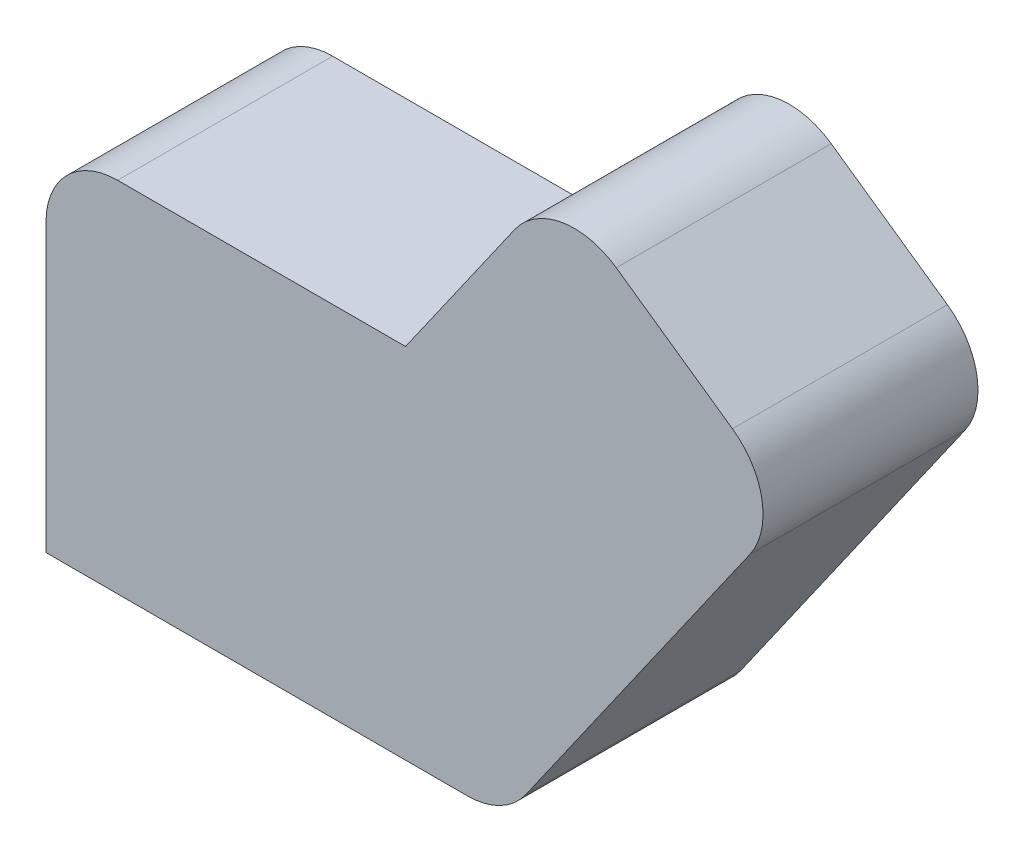
ISO-10303-21;
HEADER;
FILE_DESCRIPTION(('STEP AP214'),'2;1');
FILE_NAME('part.step','',(''),(''),'','','');
FILE_SCHEMA(('AUTOMOTIVE_DESIGN { 1 0 10303 214 1 1 1 1 }'));
ENDSEC;
DATA;
#1=APPLICATION_CONTEXT('core data for automotive mechanical design processes');
#2=APPLICATION_PROTOCOL_DEFINITION('international standard','automotive_design',2000,#1);
#3=PRODUCT_CONTEXT('',#1,'mechanical');
#4=PRODUCT('Part','Part','',(#3));
#5=PRODUCT_RELATED_PRODUCT_CATEGORY('part','',(#4));
#6=PRODUCT_DEFINITION_FORMATION('','',#4);
#7=PRODUCT_DEFINITION_CONTEXT('part definition',#1,'design');
#8=PRODUCT_DEFINITION('design','',#6,#7);
#9=PRODUCT_DEFINITION_SHAPE('','',#8);
#10=(LENGTH_UNIT() NAMED_UNIT(*) SI_UNIT(.MILLI.,.METRE.));
#11=(NAMED_UNIT(*) PLANE_ANGLE_UNIT() SI_UNIT($,.RADIAN.));
#12=(NAMED_UNIT(*) SI_UNIT($,.STERADIAN.) SOLID_ANGLE_UNIT());
#13=UNCERTAINTY_MEASURE_WITH_UNIT(LENGTH_MEASURE(1.E-05),#10,'distance_accuracy_value','');
#14=(GEOMETRIC_REPRESENTATION_CONTEXT(3) GLOBAL_UNCERTAINTY_ASSIGNED_CONTEXT((#13)) GLOBAL_UNIT_ASSIGNED_CONTEXT((#10,
#11,#12)) REPRESENTATION_CONTEXT('',''));
#15=CARTESIAN_POINT('',(0.,0.,0.));
#16=DIRECTION('',(0.,0.,1.));
#17=DIRECTION('',(1.,0.,0.));
#18=AXIS2_PLACEMENT_3D('',#15,#16,#17);
#19=CARTESIAN_POINT('',(0.,25.,15.));
#20=DIRECTION('',(1.,0.,0.));
#21=DIRECTION('',(0.,0.,-1.));
#22=AXIS2_PLACEMENT_3D('',#19,#20,#21);
#23=PLANE('',#22);
#24=DIRECTION('',(0.,-1.,0.));
#25=VECTOR('',#24,1.);
#26=CARTESIAN_POINT('',(0.,25.,15.));
#27=LINE('',#26,#25);
#28=CARTESIAN_POINT('',(0.,20.,15.));
#29=VERTEX_POINT('',#28);
#30=CARTESIAN_POINT('',(0.,0.,15.));
#31=VERTEX_POINT('',#30);
#32=EDGE_CURVE('E110',#29,#31,#27,.T.);
#33=ORIENTED_EDGE('',*,*,#32,.F.);
#34=DIRECTION('',(0.,0.,-1.));
#35=VECTOR('',#34,1.);
#36=CARTESIAN_POINT('',(0.,20.,15.));
#37=LINE('',#36,#35);
#38=CARTESIAN_POINT('',(0.,20.,0.));
#39=VERTEX_POINT('',#38);
#40=EDGE_CURVE('E162',#29,#39,#37,.T.);
#41=ORIENTED_EDGE('',*,*,#40,.T.);
#42=DIRECTION('',(0.,-1.,0.));
#43=VECTOR('',#42,1.);
#44=CARTESIAN_POINT('',(0.,25.,0.));
#45=LINE('',#44,#43);
#46=CARTESIAN_POINT('',(0.,0.,0.));
#47=VERTEX_POINT('',#46);
#48=EDGE_CURVE('E134',#39,#47,#45,.T.);
#49=ORIENTED_EDGE('',*,*,#48,.T.);
#50=DIRECTION('',(0.,0.,-1.));
#51=VECTOR('',#50,1.);
#52=CARTESIAN_POINT('',(0.,0.,15.));
#53=LINE('',#52,#51);
#54=EDGE_CURVE('E128',#31,#47,#53,.T.);
#55=ORIENTED_EDGE('',*,*,#54,.F.);
#56=EDGE_LOOP('',(#33,#41,#49,#55));
#57=FACE_BOUND('',#56,.T.);
#58=ADVANCED_FACE('F33',(#57),#23,.F.);
#59=CARTESIAN_POINT('',(0.,0.,15.));
#60=DIRECTION('',(0.,1.,0.));
#61=DIRECTION('',(0.,0.,1.));
#62=AXIS2_PLACEMENT_3D('',#59,#60,#61);
#63=PLANE('',#62);
#64=DIRECTION('',(1.,0.,0.));
#65=VECTOR('',#64,1.);
#66=CARTESIAN_POINT('',(0.,0.,0.));
#67=LINE('',#66,#65);
#68=CARTESIAN_POINT('',(29.3971647472413,0.,0.));
#69=VERTEX_POINT('',#68);
#70=EDGE_CURVE('E187',#47,#69,#67,.T.);
#71=ORIENTED_EDGE('',*,*,#70,.T.);
#72=DIRECTION('',(0.,0.,-1.));
#73=VECTOR('',#72,1.);
#74=CARTESIAN_POINT('',(29.3971647472413,0.,15.));
#75=LINE('',#74,#73);
#76=CARTESIAN_POINT('',(29.3971647472413,0.,15.));
#77=VERTEX_POINT('',#76);
#78=EDGE_CURVE('E130',#69,#77,#75,.F.);
#79=ORIENTED_EDGE('',*,*,#78,.T.);
#80=DIRECTION('',(1.,0.,0.));
#81=VECTOR('',#80,1.);
#82=CARTESIAN_POINT('',(0.,0.,15.));
#83=LINE('',#82,#81);
#84=EDGE_CURVE('E113',#31,#77,#83,.T.);
#85=ORIENTED_EDGE('',*,*,#84,.F.);
#86=ORIENTED_EDGE('',*,*,#54,.T.);
#87=EDGE_LOOP('',(#71,#79,#85,#86));
#88=FACE_BOUND('',#87,.T.);
#89=ADVANCED_FACE('F127',(#88),#63,.F.);
#90=CARTESIAN_POINT('',(32.,0.,15.));
#91=DIRECTION('',(-0.819152044288993,0.573576436351044,0.));
#92=DIRECTION('',(-0.573576436351044,-0.819152044288994,0.));
#93=AXIS2_PLACEMENT_3D('',#90,#91,#92);
#94=PLANE('',#93);
#95=DIRECTION('',(0.573576436351044,0.819152044288993,0.));
#96=VECTOR('',#95,1.);
#97=CARTESIAN_POINT('',(32.,0.,0.));
#98=LINE('',#97,#96);
#99=CARTESIAN_POINT('',(33.4929249686862,2.13211781824478,0.));
#100=VERTEX_POINT('',#99);
#101=CARTESIAN_POINT('',(49.1321178182448,24.4671999133975,0.));
#102=VERTEX_POINT('',#101);
#103=EDGE_CURVE('E184',#100,#102,#98,.T.);
#104=ORIENTED_EDGE('',*,*,#103,.T.);
#105=DIRECTION('',(0.,0.,-1.));
#106=VECTOR('',#105,1.);
#107=CARTESIAN_POINT('',(49.1321178182448,24.4671999133975,15.));
#108=LINE('',#107,#106);
#109=CARTESIAN_POINT('',(49.1321178182448,24.4671999133975,15.));
#110=VERTEX_POINT('',#109);
#111=EDGE_CURVE('E41',#102,#110,#108,.F.);
#112=ORIENTED_EDGE('',*,*,#111,.T.);
#113=DIRECTION('',(0.573576436351044,0.819152044288993,0.));
#114=VECTOR('',#113,1.);
#115=CARTESIAN_POINT('',(32.,0.,15.));
#116=LINE('',#115,#114);
#117=CARTESIAN_POINT('',(33.4929249686862,2.13211781824478,15.));
#118=VERTEX_POINT('',#117);
#119=EDGE_CURVE('E131',#118,#110,#116,.T.);
#120=ORIENTED_EDGE('',*,*,#119,.F.);
#121=DIRECTION('',(0.,0.,-1.));
#122=VECTOR('',#121,1.);
#123=CARTESIAN_POINT('',(33.4929249686862,2.13211781824478,15.));
#124=LINE('',#123,#122);
#125=EDGE_CURVE('E154',#118,#100,#124,.T.);
#126=ORIENTED_EDGE('',*,*,#125,.T.);
#127=EDGE_LOOP('',(#104,#112,#120,#126));
#128=FACE_BOUND('',#127,.T.);
#129=ADVANCED_FACE('F216',(#128),#94,.F.);
#130=CARTESIAN_POINT('',(52.,28.5629601348424,15.));
#131=DIRECTION('',(-0.573576436351043,-0.819152044288994,0.));
#132=DIRECTION('',(0.819152044288994,-0.573576436351043,0.));
#133=AXIS2_PLACEMENT_3D('',#130,#131,#132);
#134=PLANE('',#133);
#135=DIRECTION('',(-0.819152044288994,0.573576436351043,0.));
#136=VECTOR('',#135,1.);
#137=CARTESIAN_POINT('',(52.,28.5629601348424,15.));
#138=LINE('',#137,#136);
#139=CARTESIAN_POINT('',(47.904239778555,31.4308423165977,15.));
#140=VERTEX_POINT('',#139);
#141=CARTESIAN_POINT('',(39.794634540094,37.109249036473,15.));
#142=VERTEX_POINT('',#141);
#143=EDGE_CURVE('E177',#140,#142,#138,.T.);
#144=ORIENTED_EDGE('',*,*,#143,.F.);
#145=DIRECTION('',(0.,0.,-1.));
#146=VECTOR('',#145,1.);
#147=CARTESIAN_POINT('',(47.904239778555,31.4308423165977,15.));
#148=LINE('',#147,#146);
#149=CARTESIAN_POINT('',(47.904239778555,31.4308423165977,0.));
#150=VERTEX_POINT('',#149);
#151=EDGE_CURVE('E169',#140,#150,#148,.T.);
#152=ORIENTED_EDGE('',*,*,#151,.T.);
#153=DIRECTION('',(-0.819152044288994,0.573576436351043,0.));
#154=VECTOR('',#153,1.);
#155=CARTESIAN_POINT('',(52.,28.5629601348424,0.));
#156=LINE('',#155,#154);
#157=CARTESIAN_POINT('',(39.794634540094,37.109249036473,0.));
#158=VERTEX_POINT('',#157);
#159=EDGE_CURVE('E176',#150,#158,#156,.T.);
#160=ORIENTED_EDGE('',*,*,#159,.T.);
#161=DIRECTION('',(0.,0.,-1.));
#162=VECTOR('',#161,1.);
#163=CARTESIAN_POINT('',(39.794634540094,37.109249036473,15.));
#164=LINE('',#163,#162);
#165=EDGE_CURVE('E149',#158,#142,#164,.F.);
#166=ORIENTED_EDGE('',*,*,#165,.T.);
#167=EDGE_LOOP('',(#144,#152,#160,#166));
#168=FACE_BOUND('',#167,.T.);
#169=ADVANCED_FACE('F175',(#168),#134,.F.);
#170=CARTESIAN_POINT('',(35.6169591142201,40.0344888618633,15.));
#171=DIRECTION('',(0.819152044288993,-0.573576436351044,0.));
#172=DIRECTION('',(0.573576436351044,0.819152044288994,0.));
#173=AXIS2_PLACEMENT_3D('',#170,#171,#172);
#174=PLANE('',#173);
#175=DIRECTION('',(-0.573576436351044,-0.819152044288993,0.));
#176=VECTOR('',#175,1.);
#177=CARTESIAN_POINT('',(35.6169591142201,40.0344888618633,15.));
#178=LINE('',#177,#176);
#179=CARTESIAN_POINT('',(32.6917192888298,35.8568134359894,15.));
#180=VERTEX_POINT('',#179);
#181=CARTESIAN_POINT('',(25.0896966800136,25.,15.));
#182=VERTEX_POINT('',#181);
#183=EDGE_CURVE('E202',#180,#182,#178,.T.);
#184=ORIENTED_EDGE('',*,*,#183,.F.);
#185=DIRECTION('',(0.,0.,-1.));
#186=VECTOR('',#185,1.);
#187=CARTESIAN_POINT('',(32.6917192888298,35.8568134359894,15.));
#188=LINE('',#187,#186);
#189=CARTESIAN_POINT('',(32.6917192888298,35.8568134359894,0.));
#190=VERTEX_POINT('',#189);
#191=EDGE_CURVE('E136',#180,#190,#188,.T.);
#192=ORIENTED_EDGE('',*,*,#191,.T.);
#193=DIRECTION('',(-0.573576436351044,-0.819152044288993,0.));
#194=VECTOR('',#193,1.);
#195=CARTESIAN_POINT('',(35.6169591142201,40.0344888618633,0.));
#196=LINE('',#195,#194);
#197=CARTESIAN_POINT('',(25.0896966800136,25.,0.));
#198=VERTEX_POINT('',#197);
#199=EDGE_CURVE('E183',#190,#198,#196,.T.);
#200=ORIENTED_EDGE('',*,*,#199,.T.);
#201=DIRECTION('',(0.,0.,-1.));
#202=VECTOR('',#201,1.);
#203=CARTESIAN_POINT('',(25.0896966800136,25.,15.));
#204=LINE('',#203,#202);
#205=EDGE_CURVE('E137',#182,#198,#204,.T.);
#206=ORIENTED_EDGE('',*,*,#205,.F.);
#207=EDGE_LOOP('',(#184,#192,#200,#206));
#208=FACE_BOUND('',#207,.T.);
#209=ADVANCED_FACE('F232',(#208),#174,.F.);
#210=CARTESIAN_POINT('',(25.0896966800136,25.,15.));
#211=DIRECTION('',(0.,-1.,0.));
#212=DIRECTION('',(1.,0.,0.));
#213=AXIS2_PLACEMENT_3D('',#210,#211,#212);
#214=PLANE('',#213);
#215=DIRECTION('',(-1.,0.,0.));
#216=VECTOR('',#215,1.);
#217=CARTESIAN_POINT('',(25.0896966800136,25.,0.));
#218=LINE('',#217,#216);
#219=CARTESIAN_POINT('',(5.,25.,0.));
#220=VERTEX_POINT('',#219);
#221=EDGE_CURVE('E122',#198,#220,#218,.T.);
#222=ORIENTED_EDGE('',*,*,#221,.T.);
#223=DIRECTION('',(0.,0.,-1.));
#224=VECTOR('',#223,1.);
#225=CARTESIAN_POINT('',(5.,25.,15.));
#226=LINE('',#225,#224);
#227=CARTESIAN_POINT('',(5.,25.,15.));
#228=VERTEX_POINT('',#227);
#229=EDGE_CURVE('E166',#220,#228,#226,.F.);
#230=ORIENTED_EDGE('',*,*,#229,.T.);
#231=DIRECTION('',(-1.,0.,0.));
#232=VECTOR('',#231,1.);
#233=CARTESIAN_POINT('',(25.0896966800136,25.,15.));
#234=LINE('',#233,#232);
#235=EDGE_CURVE('E143',#182,#228,#234,.T.);
#236=ORIENTED_EDGE('',*,*,#235,.F.);
#237=ORIENTED_EDGE('',*,*,#205,.T.);
#238=EDGE_LOOP('',(#222,#230,#236,#237));
#239=FACE_BOUND('',#238,.T.);
#240=ADVANCED_FACE('F194',(#239),#214,.F.);
#241=CARTESIAN_POINT('',(0.,0.,15.));
#242=DIRECTION('',(0.,0.,1.));
#243=DIRECTION('',(1.,0.,0.));
#244=AXIS2_PLACEMENT_3D('',#241,#242,#243);
#245=PLANE('',#244);
#246=ORIENTED_EDGE('',*,*,#119,.T.);
#247=CARTESIAN_POINT('',(45.0363575967998,27.3350820951527,15.));
#248=DIRECTION('',(0.,0.,1.));
#249=DIRECTION('',(1.,0.,0.));
#250=AXIS2_PLACEMENT_3D('',#247,#248,#249);
#251=CIRCLE('',#250,5.);
#252=EDGE_CURVE('E11',#110,#140,#251,.T.);
#253=ORIENTED_EDGE('',*,*,#252,.T.);
#254=ORIENTED_EDGE('',*,*,#143,.T.);
#255=CARTESIAN_POINT('',(36.8693947147037,32.9315736105991,15.));
#256=DIRECTION('',(0.,0.,1.));
#257=DIRECTION('',(1.,0.,0.));
#258=AXIS2_PLACEMENT_3D('',#255,#256,#257);
#259=CIRCLE('',#258,5.1);
#260=EDGE_CURVE('E152',#142,#180,#259,.T.);
#261=ORIENTED_EDGE('',*,*,#260,.T.);
#262=ORIENTED_EDGE('',*,*,#183,.T.);
#263=ORIENTED_EDGE('',*,*,#235,.T.);
#264=CARTESIAN_POINT('',(5.,20.,15.));
#265=DIRECTION('',(0.,0.,1.));
#266=DIRECTION('',(1.,0.,0.));
#267=AXIS2_PLACEMENT_3D('',#264,#265,#266);
#268=CIRCLE('',#267,5.);
#269=EDGE_CURVE('E117',#228,#29,#268,.T.);
#270=ORIENTED_EDGE('',*,*,#269,.T.);
#271=ORIENTED_EDGE('',*,*,#32,.T.);
#272=ORIENTED_EDGE('',*,*,#84,.T.);
#273=CARTESIAN_POINT('',(29.3971647472413,5.,15.));
#274=DIRECTION('',(0.,0.,1.));
#275=DIRECTION('',(1.,0.,0.));
#276=AXIS2_PLACEMENT_3D('',#273,#274,#275);
#277=CIRCLE('',#276,5.);
#278=EDGE_CURVE('E160',#77,#118,#277,.T.);
#279=ORIENTED_EDGE('',*,*,#278,.T.);
#280=EDGE_LOOP('',(#246,#253,#254,#261,#262,#263,#270,#271,#272,#279));
#281=FACE_BOUND('',#280,.T.);
#282=ADVANCED_FACE('F112',(#281),#245,.T.);
#283=CARTESIAN_POINT('',(0.,0.,0.));
#284=DIRECTION('',(0.,0.,1.));
#285=DIRECTION('',(1.,0.,0.));
#286=AXIS2_PLACEMENT_3D('',#283,#284,#285);
#287=PLANE('',#286);
#288=ORIENTED_EDGE('',*,*,#159,.F.);
#289=CARTESIAN_POINT('',(45.0363575967998,27.3350820951527,0.));
#290=DIRECTION('',(0.,0.,1.));
#291=DIRECTION('',(1.,0.,0.));
#292=AXIS2_PLACEMENT_3D('',#289,#290,#291);
#293=CIRCLE('',#292,5.);
#294=EDGE_CURVE('E55',#150,#102,#293,.F.);
#295=ORIENTED_EDGE('',*,*,#294,.T.);
#296=ORIENTED_EDGE('',*,*,#103,.F.);
#297=CARTESIAN_POINT('',(29.3971647472413,5.,0.));
#298=DIRECTION('',(0.,0.,1.));
#299=DIRECTION('',(1.,0.,0.));
#300=AXIS2_PLACEMENT_3D('',#297,#298,#299);
#301=CIRCLE('',#300,5.);
#302=EDGE_CURVE('E157',#100,#69,#301,.F.);
#303=ORIENTED_EDGE('',*,*,#302,.T.);
#304=ORIENTED_EDGE('',*,*,#70,.F.);
#305=ORIENTED_EDGE('',*,*,#48,.F.);
#306=CARTESIAN_POINT('',(5.,20.,0.));
#307=DIRECTION('',(0.,0.,1.));
#308=DIRECTION('',(1.,0.,0.));
#309=AXIS2_PLACEMENT_3D('',#306,#307,#308);
#310=CIRCLE('',#309,5.);
#311=EDGE_CURVE('E164',#39,#220,#310,.F.);
#312=ORIENTED_EDGE('',*,*,#311,.T.);
#313=ORIENTED_EDGE('',*,*,#221,.F.);
#314=ORIENTED_EDGE('',*,*,#199,.F.);
#315=CARTESIAN_POINT('',(36.8693947147037,32.9315736105991,0.));
#316=DIRECTION('',(0.,0.,1.));
#317=DIRECTION('',(1.,0.,0.));
#318=AXIS2_PLACEMENT_3D('',#315,#316,#317);
#319=CIRCLE('',#318,5.1);
#320=EDGE_CURVE('E140',#190,#158,#319,.F.);
#321=ORIENTED_EDGE('',*,*,#320,.T.);
#322=EDGE_LOOP('',(#288,#295,#296,#303,#304,#305,#312,#313,#314,#321));
#323=FACE_BOUND('',#322,.T.);
#324=ADVANCED_FACE('F180',(#323),#287,.F.);
#325=CARTESIAN_POINT('',(36.8693947147037,32.9315736105991,15.));
#326=DIRECTION('',(0.,0.,-1.));
#327=DIRECTION('',(-1.,0.,0.));
#328=AXIS2_PLACEMENT_3D('',#325,#326,#327);
#329=CYLINDRICAL_SURFACE('',#328,5.1);
#330=ORIENTED_EDGE('',*,*,#260,.F.);
#331=ORIENTED_EDGE('',*,*,#165,.F.);
#332=ORIENTED_EDGE('',*,*,#320,.F.);
#333=ORIENTED_EDGE('',*,*,#191,.F.);
#334=EDGE_LOOP('',(#330,#331,#332,#333));
#335=FACE_BOUND('',#334,.T.);
#336=ADVANCED_FACE('F220',(#335),#329,.T.);
#337=CARTESIAN_POINT('',(29.3971647472413,5.,15.));
#338=DIRECTION('',(0.,0.,-1.));
#339=DIRECTION('',(-1.,0.,0.));
#340=AXIS2_PLACEMENT_3D('',#337,#338,#339);
#341=CYLINDRICAL_SURFACE('',#340,5.);
#342=ORIENTED_EDGE('',*,*,#278,.F.);
#343=ORIENTED_EDGE('',*,*,#78,.F.);
#344=ORIENTED_EDGE('',*,*,#302,.F.);
#345=ORIENTED_EDGE('',*,*,#125,.F.);
#346=EDGE_LOOP('',(#342,#343,#344,#345));
#347=FACE_BOUND('',#346,.T.);
#348=ADVANCED_FACE('F210',(#347),#341,.T.);
#349=CARTESIAN_POINT('',(5.,20.,15.));
#350=DIRECTION('',(0.,0.,-1.));
#351=DIRECTION('',(-1.,0.,0.));
#352=AXIS2_PLACEMENT_3D('',#349,#350,#351);
#353=CYLINDRICAL_SURFACE('',#352,5.);
#354=ORIENTED_EDGE('',*,*,#269,.F.);
#355=ORIENTED_EDGE('',*,*,#229,.F.);
#356=ORIENTED_EDGE('',*,*,#311,.F.);
#357=ORIENTED_EDGE('',*,*,#40,.F.);
#358=EDGE_LOOP('',(#354,#355,#356,#357));
#359=FACE_BOUND('',#358,.T.);
#360=ADVANCED_FACE('F198',(#359),#353,.T.);
#361=CARTESIAN_POINT('',(45.0363575967998,27.3350820951527,15.));
#362=DIRECTION('',(0.,0.,-1.));
#363=DIRECTION('',(-1.,0.,0.));
#364=AXIS2_PLACEMENT_3D('',#361,#362,#363);
#365=CYLINDRICAL_SURFACE('',#364,5.);
#366=ORIENTED_EDGE('',*,*,#252,.F.);
#367=ORIENTED_EDGE('',*,*,#111,.F.);
#368=ORIENTED_EDGE('',*,*,#294,.F.);
#369=ORIENTED_EDGE('',*,*,#151,.F.);
#370=EDGE_LOOP('',(#366,#367,#368,#369));
#371=FACE_BOUND('',#370,.T.);
#372=ADVANCED_FACE('F35',(#371),#365,.T.);
#373=CLOSED_SHELL('',(#58,#89,#129,#169,#209,#240,#282,#324,#336,#348,#360,#372));
#374=MANIFOLD_SOLID_BREP('B2',#373);
#375=ADVANCED_BREP_SHAPE_REPRESENTATION('',(#18,#374),#14);
#376=SHAPE_DEFINITION_REPRESENTATION(#9,#375);
ENDSEC;
END-ISO-10303-21;
